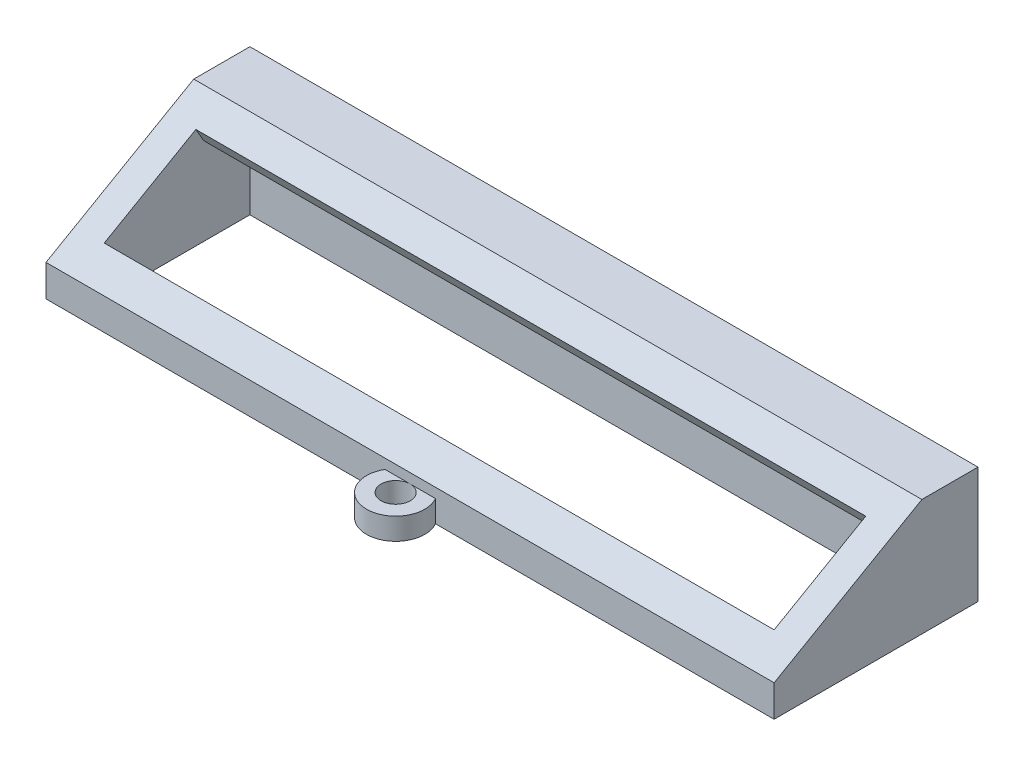
ISO-10303-21;
HEADER;
FILE_DESCRIPTION(('STEP AP214'),'2;1');
FILE_NAME('part.step','',(''),(''),'','','');
FILE_SCHEMA(('AUTOMOTIVE_DESIGN { 1 0 10303 214 1 1 1 1 }'));
ENDSEC;
DATA;
#1=APPLICATION_CONTEXT('core data for automotive mechanical design processes');
#2=APPLICATION_PROTOCOL_DEFINITION('international standard','automotive_design',2000,#1);
#3=PRODUCT_CONTEXT('',#1,'mechanical');
#4=PRODUCT('Part','Part','',(#3));
#5=PRODUCT_RELATED_PRODUCT_CATEGORY('part','',(#4));
#6=PRODUCT_DEFINITION_FORMATION('','',#4);
#7=PRODUCT_DEFINITION_CONTEXT('part definition',#1,'design');
#8=PRODUCT_DEFINITION('design','',#6,#7);
#9=PRODUCT_DEFINITION_SHAPE('','',#8);
#10=(LENGTH_UNIT() NAMED_UNIT(*) SI_UNIT(.MILLI.,.METRE.));
#11=(NAMED_UNIT(*) PLANE_ANGLE_UNIT() SI_UNIT($,.RADIAN.));
#12=(NAMED_UNIT(*) SI_UNIT($,.STERADIAN.) SOLID_ANGLE_UNIT());
#13=UNCERTAINTY_MEASURE_WITH_UNIT(LENGTH_MEASURE(1.E-05),#10,'distance_accuracy_value','');
#14=(GEOMETRIC_REPRESENTATION_CONTEXT(3) GLOBAL_UNCERTAINTY_ASSIGNED_CONTEXT((#13)) GLOBAL_UNIT_ASSIGNED_CONTEXT((#10,
#11,#12)) REPRESENTATION_CONTEXT('',''));
#15=CARTESIAN_POINT('',(0.,0.,0.));
#16=DIRECTION('',(0.,0.,1.));
#17=DIRECTION('',(1.,0.,0.));
#18=AXIS2_PLACEMENT_3D('',#15,#16,#17);
#19=CARTESIAN_POINT('',(250.,80.,-70.));
#20=DIRECTION('',(-1.,0.,0.));
#21=DIRECTION('',(0.,0.,1.));
#22=AXIS2_PLACEMENT_3D('',#19,#20,#21);
#23=PLANE('',#22);
#24=DIRECTION('',(0.,0.,-1.));
#25=VECTOR('',#24,1.);
#26=CARTESIAN_POINT('',(250.,80.,-70.));
#27=LINE('',#26,#25);
#28=CARTESIAN_POINT('',(250.,80.,-31.4570736418901));
#29=VERTEX_POINT('',#28);
#30=CARTESIAN_POINT('',(250.,80.,-70.));
#31=VERTEX_POINT('',#30);
#32=EDGE_CURVE('E215',#29,#31,#27,.T.);
#33=ORIENTED_EDGE('',*,*,#32,.F.);
#34=DIRECTION('',(0.,0.498039271037889,-0.86715447557171));
#35=VECTOR('',#34,1.);
#36=CARTESIAN_POINT('',(250.,21.729405288567,70.));
#37=LINE('',#36,#35);
#38=CARTESIAN_POINT('',(250.,21.729405288567,70.));
#39=VERTEX_POINT('',#38);
#40=EDGE_CURVE('E53',#39,#29,#37,.T.);
#41=ORIENTED_EDGE('',*,*,#40,.F.);
#42=DIRECTION('',(0.,-1.,0.));
#43=VECTOR('',#42,1.);
#44=CARTESIAN_POINT('',(250.,80.,70.));
#45=LINE('',#44,#43);
#46=CARTESIAN_POINT('',(250.,0.,70.));
#47=VERTEX_POINT('',#46);
#48=EDGE_CURVE('E223',#39,#47,#45,.T.);
#49=ORIENTED_EDGE('',*,*,#48,.T.);
#50=DIRECTION('',(0.,0.,-1.));
#51=VECTOR('',#50,1.);
#52=CARTESIAN_POINT('',(250.,0.,-70.));
#53=LINE('',#52,#51);
#54=CARTESIAN_POINT('',(250.,0.,-70.));
#55=VERTEX_POINT('',#54);
#56=EDGE_CURVE('E209',#47,#55,#53,.T.);
#57=ORIENTED_EDGE('',*,*,#56,.T.);
#58=DIRECTION('',(0.,-1.,0.));
#59=VECTOR('',#58,1.);
#60=CARTESIAN_POINT('',(250.,80.,-70.));
#61=LINE('',#60,#59);
#62=EDGE_CURVE('E238',#31,#55,#61,.T.);
#63=ORIENTED_EDGE('',*,*,#62,.F.);
#64=EDGE_LOOP('',(#33,#41,#49,#57,#63));
#65=FACE_BOUND('',#64,.T.);
#66=ADVANCED_FACE('F39',(#65),#23,.F.);
#67=CARTESIAN_POINT('',(-250.,80.,-70.));
#68=DIRECTION('',(0.,0.,1.));
#69=DIRECTION('',(1.,0.,0.));
#70=AXIS2_PLACEMENT_3D('',#67,#68,#69);
#71=PLANE('',#70);
#72=DIRECTION('',(-1.,0.,0.));
#73=VECTOR('',#72,1.);
#74=CARTESIAN_POINT('',(-250.,0.,-70.));
#75=LINE('',#74,#73);
#76=CARTESIAN_POINT('',(-250.,0.,-70.));
#77=VERTEX_POINT('',#76);
#78=EDGE_CURVE('E226',#55,#77,#75,.T.);
#79=ORIENTED_EDGE('',*,*,#78,.T.);
#80=DIRECTION('',(0.,-1.,0.));
#81=VECTOR('',#80,1.);
#82=CARTESIAN_POINT('',(-250.,80.,-70.));
#83=LINE('',#82,#81);
#84=CARTESIAN_POINT('',(-250.,80.,-70.));
#85=VERTEX_POINT('',#84);
#86=EDGE_CURVE('E236',#85,#77,#83,.T.);
#87=ORIENTED_EDGE('',*,*,#86,.F.);
#88=DIRECTION('',(-1.,0.,0.));
#89=VECTOR('',#88,1.);
#90=CARTESIAN_POINT('',(-250.,80.,-70.));
#91=LINE('',#90,#89);
#92=EDGE_CURVE('E217',#31,#85,#91,.T.);
#93=ORIENTED_EDGE('',*,*,#92,.F.);
#94=ORIENTED_EDGE('',*,*,#62,.T.);
#95=EDGE_LOOP('',(#79,#87,#93,#94));
#96=FACE_BOUND('',#95,.T.);
#97=ADVANCED_FACE('F270',(#96),#71,.F.);
#98=CARTESIAN_POINT('',(-250.,80.,-70.));
#99=DIRECTION('',(1.,0.,0.));
#100=DIRECTION('',(0.,0.,-1.));
#101=AXIS2_PLACEMENT_3D('',#98,#99,#100);
#102=PLANE('',#101);
#103=DIRECTION('',(0.,-1.,0.));
#104=VECTOR('',#103,1.);
#105=CARTESIAN_POINT('',(-250.,80.,70.));
#106=LINE('',#105,#104);
#107=CARTESIAN_POINT('',(-250.,21.729405288567,70.));
#108=VERTEX_POINT('',#107);
#109=CARTESIAN_POINT('',(-250.,0.,70.));
#110=VERTEX_POINT('',#109);
#111=EDGE_CURVE('E234',#108,#110,#106,.T.);
#112=ORIENTED_EDGE('',*,*,#111,.F.);
#113=DIRECTION('',(0.,0.498039271037889,-0.86715447557171));
#114=VECTOR('',#113,1.);
#115=CARTESIAN_POINT('',(-250.,21.729405288567,70.));
#116=LINE('',#115,#114);
#117=CARTESIAN_POINT('',(-250.,80.,-31.4570736418901));
#118=VERTEX_POINT('',#117);
#119=EDGE_CURVE('E164',#108,#118,#116,.T.);
#120=ORIENTED_EDGE('',*,*,#119,.T.);
#121=DIRECTION('',(0.,0.,1.));
#122=VECTOR('',#121,1.);
#123=CARTESIAN_POINT('',(-250.,80.,-70.));
#124=LINE('',#123,#122);
#125=EDGE_CURVE('E220',#85,#118,#124,.T.);
#126=ORIENTED_EDGE('',*,*,#125,.F.);
#127=ORIENTED_EDGE('',*,*,#86,.T.);
#128=DIRECTION('',(0.,0.,1.));
#129=VECTOR('',#128,1.);
#130=CARTESIAN_POINT('',(-250.,0.,-70.));
#131=LINE('',#130,#129);
#132=EDGE_CURVE('E228',#77,#110,#131,.T.);
#133=ORIENTED_EDGE('',*,*,#132,.T.);
#134=EDGE_LOOP('',(#112,#120,#126,#127,#133));
#135=FACE_BOUND('',#134,.T.);
#136=ADVANCED_FACE('F267',(#135),#102,.F.);
#137=CARTESIAN_POINT('',(-250.,80.,70.));
#138=DIRECTION('',(0.,0.,-1.));
#139=DIRECTION('',(-1.,0.,0.));
#140=AXIS2_PLACEMENT_3D('',#137,#138,#139);
#141=PLANE('',#140);
#142=ORIENTED_EDGE('',*,*,#48,.F.);
#143=DIRECTION('',(1.,0.,0.));
#144=VECTOR('',#143,1.);
#145=CARTESIAN_POINT('',(-250.,21.729405288567,70.));
#146=LINE('',#145,#144);
#147=EDGE_CURVE('E167',#108,#39,#146,.T.);
#148=ORIENTED_EDGE('',*,*,#147,.F.);
#149=ORIENTED_EDGE('',*,*,#111,.T.);
#150=DIRECTION('',(1.,0.,0.));
#151=VECTOR('',#150,1.);
#152=CARTESIAN_POINT('',(-250.,0.,70.));
#153=LINE('',#152,#151);
#154=CARTESIAN_POINT('',(-17.2065014470406,0.,70.));
#155=VERTEX_POINT('',#154);
#156=EDGE_CURVE('E218',#110,#155,#153,.T.);
#157=ORIENTED_EDGE('',*,*,#156,.T.);
#158=DIRECTION('',(0.,-1.,0.));
#159=VECTOR('',#158,1.);
#160=CARTESIAN_POINT('',(-17.2065014470406,15.,70.));
#161=LINE('',#160,#159);
#162=CARTESIAN_POINT('',(-17.2065014470406,15.,70.));
#163=VERTEX_POINT('',#162);
#164=EDGE_CURVE('E183',#155,#163,#161,.F.);
#165=ORIENTED_EDGE('',*,*,#164,.T.);
#166=DIRECTION('',(-1.,0.,0.));
#167=VECTOR('',#166,1.);
#168=CARTESIAN_POINT('',(-250.,15.,70.));
#169=LINE('',#168,#167);
#170=CARTESIAN_POINT('',(0.11400662864814,15.,70.));
#171=VERTEX_POINT('',#170);
#172=EDGE_CURVE('E42',#171,#163,#169,.T.);
#173=ORIENTED_EDGE('',*,*,#172,.F.);
#174=CARTESIAN_POINT('',(17.4345147043369,15.,70.));
#175=VERTEX_POINT('',#174);
#176=EDGE_CURVE('E12',#175,#171,#169,.T.);
#177=ORIENTED_EDGE('',*,*,#176,.F.);
#178=DIRECTION('',(0.,-1.,0.));
#179=VECTOR('',#178,1.);
#180=CARTESIAN_POINT('',(17.4345147043369,15.,70.));
#181=LINE('',#180,#179);
#182=CARTESIAN_POINT('',(17.4345147043369,0.,70.));
#183=VERTEX_POINT('',#182);
#184=EDGE_CURVE('E187',#175,#183,#181,.T.);
#185=ORIENTED_EDGE('',*,*,#184,.T.);
#186=EDGE_CURVE('E231',#183,#47,#153,.T.);
#187=ORIENTED_EDGE('',*,*,#186,.T.);
#188=EDGE_LOOP('',(#142,#148,#149,#157,#165,#173,#177,#185,#187));
#189=FACE_BOUND('',#188,.T.);
#190=ADVANCED_FACE('F255',(#189),#141,.F.);
#191=CARTESIAN_POINT('',(0.,80.,0.));
#192=DIRECTION('',(0.,1.,0.));
#193=DIRECTION('',(0.,0.,1.));
#194=AXIS2_PLACEMENT_3D('',#191,#192,#193);
#195=PLANE('',#194);
#196=DIRECTION('',(1.,0.,0.));
#197=VECTOR('',#196,1.);
#198=CARTESIAN_POINT('',(-250.,80.,-31.4570736418901));
#199=LINE('',#198,#197);
#200=EDGE_CURVE('E146',#118,#29,#199,.T.);
#201=ORIENTED_EDGE('',*,*,#200,.T.);
#202=ORIENTED_EDGE('',*,*,#32,.T.);
#203=ORIENTED_EDGE('',*,*,#92,.T.);
#204=ORIENTED_EDGE('',*,*,#125,.T.);
#205=EDGE_LOOP('',(#201,#202,#203,#204));
#206=FACE_BOUND('',#205,.T.);
#207=ADVANCED_FACE('F272',(#206),#195,.T.);
#208=CARTESIAN_POINT('',(0.,0.,0.));
#209=DIRECTION('',(0.,1.,0.));
#210=DIRECTION('',(0.,0.,1.));
#211=AXIS2_PLACEMENT_3D('',#208,#209,#210);
#212=PLANE('',#211);
#213=ORIENTED_EDGE('',*,*,#186,.F.);
#214=CARTESIAN_POINT('',(0.11400662864814,0.,80.));
#215=DIRECTION('',(0.,-1.,0.));
#216=DIRECTION('',(1.,0.,0.));
#217=AXIS2_PLACEMENT_3D('',#214,#215,#216);
#218=CIRCLE('',#217,20.);
#219=EDGE_CURVE('E177',#183,#155,#218,.T.);
#220=ORIENTED_EDGE('',*,*,#219,.T.);
#221=ORIENTED_EDGE('',*,*,#156,.F.);
#222=ORIENTED_EDGE('',*,*,#132,.F.);
#223=ORIENTED_EDGE('',*,*,#78,.F.);
#224=ORIENTED_EDGE('',*,*,#56,.F.);
#225=EDGE_LOOP('',(#213,#220,#221,#222,#223,#224));
#226=FACE_BOUND('',#225,.T.);
#227=DIRECTION('',(1.,0.,0.));
#228=VECTOR('',#227,1.);
#229=CARTESIAN_POINT('',(230.,0.,-50.));
#230=LINE('',#229,#228);
#231=CARTESIAN_POINT('',(-230.,0.,-50.));
#232=VERTEX_POINT('',#231);
#233=CARTESIAN_POINT('',(230.,0.,-50.));
#234=VERTEX_POINT('',#233);
#235=EDGE_CURVE('E200',#232,#234,#230,.T.);
#236=ORIENTED_EDGE('',*,*,#235,.F.);
#237=DIRECTION('',(0.,0.,-1.));
#238=VECTOR('',#237,1.);
#239=CARTESIAN_POINT('',(-230.,0.,50.));
#240=LINE('',#239,#238);
#241=CARTESIAN_POINT('',(-230.,0.,50.));
#242=VERTEX_POINT('',#241);
#243=EDGE_CURVE('E189',#242,#232,#240,.T.);
#244=ORIENTED_EDGE('',*,*,#243,.F.);
#245=DIRECTION('',(-1.,0.,0.));
#246=VECTOR('',#245,1.);
#247=CARTESIAN_POINT('',(230.,0.,50.));
#248=LINE('',#247,#246);
#249=CARTESIAN_POINT('',(230.,0.,50.));
#250=VERTEX_POINT('',#249);
#251=EDGE_CURVE('E193',#250,#242,#248,.T.);
#252=ORIENTED_EDGE('',*,*,#251,.F.);
#253=DIRECTION('',(0.,0.,1.));
#254=VECTOR('',#253,1.);
#255=CARTESIAN_POINT('',(230.,0.,50.));
#256=LINE('',#255,#254);
#257=EDGE_CURVE('E203',#234,#250,#256,.T.);
#258=ORIENTED_EDGE('',*,*,#257,.F.);
#259=EDGE_LOOP('',(#236,#244,#252,#258));
#260=FACE_BOUND('',#259,.T.);
#261=CARTESIAN_POINT('',(0.11400662864814,0.,80.));
#262=DIRECTION('',(0.,-1.,0.));
#263=DIRECTION('',(0.,0.,-1.));
#264=AXIS2_PLACEMENT_3D('',#261,#262,#263);
#265=CIRCLE('',#264,10.);
#266=CARTESIAN_POINT('',(0.11400662864814,0.,70.));
#267=VERTEX_POINT('',#266);
#268=EDGE_CURVE('E173',#267,#267,#265,.T.);
#269=ORIENTED_EDGE('',*,*,#268,.F.);
#270=EDGE_LOOP('',(#269));
#271=FACE_BOUND('',#270,.T.);
#272=ADVANCED_FACE('F258',(#226,#260,#271),#212,.F.);
#273=CARTESIAN_POINT('',(-230.,60.,50.));
#274=DIRECTION('',(-1.,0.,0.));
#275=DIRECTION('',(0.,0.,1.));
#276=AXIS2_PLACEMENT_3D('',#273,#274,#275);
#277=PLANE('',#276);
#278=DIRECTION('',(0.,0.86715447557171,0.498039271037889));
#279=VECTOR('',#278,1.);
#280=CARTESIAN_POINT('',(-230.,56.3385513438544,-20.3773628207185));
#281=LINE('',#280,#279);
#282=CARTESIAN_POINT('',(-230.,60.,-18.2744558173876));
#283=VERTEX_POINT('',#282);
#284=CARTESIAN_POINT('',(-230.,69.34586847743,-12.9067737551501));
#285=VERTEX_POINT('',#284);
#286=EDGE_CURVE('E154',#283,#285,#281,.T.);
#287=ORIENTED_EDGE('',*,*,#286,.T.);
#288=DIRECTION('',(0.,-0.498039271037889,0.86715447557171));
#289=VECTOR('',#288,1.);
#290=CARTESIAN_POINT('',(-230.,39.8597024904933,38.432673332502));
#291=LINE('',#290,#289);
#292=CARTESIAN_POINT('',(-230.,33.2161538453229,50.));
#293=VERTEX_POINT('',#292);
#294=EDGE_CURVE('E158',#285,#293,#291,.T.);
#295=ORIENTED_EDGE('',*,*,#294,.T.);
#296=DIRECTION('',(0.,-1.,0.));
#297=VECTOR('',#296,1.);
#298=CARTESIAN_POINT('',(-230.,60.,50.));
#299=LINE('',#298,#297);
#300=EDGE_CURVE('E207',#293,#242,#299,.T.);
#301=ORIENTED_EDGE('',*,*,#300,.T.);
#302=ORIENTED_EDGE('',*,*,#243,.T.);
#303=DIRECTION('',(0.,-1.,0.));
#304=VECTOR('',#303,1.);
#305=CARTESIAN_POINT('',(-230.,60.,-50.));
#306=LINE('',#305,#304);
#307=CARTESIAN_POINT('',(-230.,60.,-50.));
#308=VERTEX_POINT('',#307);
#309=EDGE_CURVE('E198',#308,#232,#306,.T.);
#310=ORIENTED_EDGE('',*,*,#309,.F.);
#311=DIRECTION('',(0.,0.,-1.));
#312=VECTOR('',#311,1.);
#313=CARTESIAN_POINT('',(-230.,60.,50.));
#314=LINE('',#313,#312);
#315=EDGE_CURVE('E190',#283,#308,#314,.T.);
#316=ORIENTED_EDGE('',*,*,#315,.F.);
#317=EDGE_LOOP('',(#287,#295,#301,#302,#310,#316));
#318=FACE_BOUND('',#317,.T.);
#319=ADVANCED_FACE('F299',(#318),#277,.F.);
#320=CARTESIAN_POINT('',(230.,60.,50.));
#321=DIRECTION('',(0.,0.,1.));
#322=DIRECTION('',(1.,0.,0.));
#323=AXIS2_PLACEMENT_3D('',#320,#321,#322);
#324=PLANE('',#323);
#325=ORIENTED_EDGE('',*,*,#300,.F.);
#326=DIRECTION('',(1.,0.,0.));
#327=VECTOR('',#326,1.);
#328=CARTESIAN_POINT('',(230.,33.2161538453229,50.));
#329=LINE('',#328,#327);
#330=CARTESIAN_POINT('',(230.,33.2161538453229,50.));
#331=VERTEX_POINT('',#330);
#332=EDGE_CURVE('E145',#293,#331,#329,.T.);
#333=ORIENTED_EDGE('',*,*,#332,.T.);
#334=DIRECTION('',(0.,-1.,0.));
#335=VECTOR('',#334,1.);
#336=CARTESIAN_POINT('',(230.,60.,50.));
#337=LINE('',#336,#335);
#338=EDGE_CURVE('E141',#331,#250,#337,.T.);
#339=ORIENTED_EDGE('',*,*,#338,.T.);
#340=ORIENTED_EDGE('',*,*,#251,.T.);
#341=EDGE_LOOP('',(#325,#333,#339,#340));
#342=FACE_BOUND('',#341,.T.);
#343=ADVANCED_FACE('F304',(#342),#324,.F.);
#344=CARTESIAN_POINT('',(230.,60.,50.));
#345=DIRECTION('',(1.,0.,0.));
#346=DIRECTION('',(0.,0.,-1.));
#347=AXIS2_PLACEMENT_3D('',#344,#345,#346);
#348=PLANE('',#347);
#349=DIRECTION('',(0.,0.86715447557171,0.498039271037889));
#350=VECTOR('',#349,1.);
#351=CARTESIAN_POINT('',(230.,56.3385513438544,-20.3773628207185));
#352=LINE('',#351,#350);
#353=CARTESIAN_POINT('',(230.,60.,-18.2744558173876));
#354=VERTEX_POINT('',#353);
#355=CARTESIAN_POINT('',(230.,69.34586847743,-12.9067737551501));
#356=VERTEX_POINT('',#355);
#357=EDGE_CURVE('E138',#354,#356,#352,.T.);
#358=ORIENTED_EDGE('',*,*,#357,.F.);
#359=DIRECTION('',(0.,0.,1.));
#360=VECTOR('',#359,1.);
#361=CARTESIAN_POINT('',(230.,60.,50.));
#362=LINE('',#361,#360);
#363=CARTESIAN_POINT('',(230.,60.,-50.));
#364=VERTEX_POINT('',#363);
#365=EDGE_CURVE('E196',#364,#354,#362,.T.);
#366=ORIENTED_EDGE('',*,*,#365,.F.);
#367=DIRECTION('',(0.,-1.,0.));
#368=VECTOR('',#367,1.);
#369=CARTESIAN_POINT('',(230.,60.,-50.));
#370=LINE('',#369,#368);
#371=EDGE_CURVE('E211',#364,#234,#370,.T.);
#372=ORIENTED_EDGE('',*,*,#371,.T.);
#373=ORIENTED_EDGE('',*,*,#257,.T.);
#374=ORIENTED_EDGE('',*,*,#338,.F.);
#375=DIRECTION('',(0.,0.498039271037889,-0.86715447557171));
#376=VECTOR('',#375,1.);
#377=CARTESIAN_POINT('',(230.,39.8597024904933,38.432673332502));
#378=LINE('',#377,#376);
#379=EDGE_CURVE('E134',#331,#356,#378,.T.);
#380=ORIENTED_EDGE('',*,*,#379,.T.);
#381=EDGE_LOOP('',(#358,#366,#372,#373,#374,#380));
#382=FACE_BOUND('',#381,.T.);
#383=ADVANCED_FACE('F136',(#382),#348,.F.);
#384=CARTESIAN_POINT('',(230.,60.,-50.));
#385=DIRECTION('',(0.,0.,-1.));
#386=DIRECTION('',(-1.,0.,0.));
#387=AXIS2_PLACEMENT_3D('',#384,#385,#386);
#388=PLANE('',#387);
#389=ORIENTED_EDGE('',*,*,#235,.T.);
#390=ORIENTED_EDGE('',*,*,#371,.F.);
#391=DIRECTION('',(1.,0.,0.));
#392=VECTOR('',#391,1.);
#393=CARTESIAN_POINT('',(230.,60.,-50.));
#394=LINE('',#393,#392);
#395=EDGE_CURVE('E192',#308,#364,#394,.T.);
#396=ORIENTED_EDGE('',*,*,#395,.F.);
#397=ORIENTED_EDGE('',*,*,#309,.T.);
#398=EDGE_LOOP('',(#389,#390,#396,#397));
#399=FACE_BOUND('',#398,.T.);
#400=ADVANCED_FACE('F306',(#399),#388,.F.);
#401=CARTESIAN_POINT('',(0.,60.,0.));
#402=DIRECTION('',(0.,1.,0.));
#403=DIRECTION('',(0.,0.,1.));
#404=AXIS2_PLACEMENT_3D('',#401,#402,#403);
#405=PLANE('',#404);
#406=ORIENTED_EDGE('',*,*,#365,.T.);
#407=DIRECTION('',(-1.,0.,0.));
#408=VECTOR('',#407,1.);
#409=CARTESIAN_POINT('',(0.,60.,-18.2744558173876));
#410=LINE('',#409,#408);
#411=EDGE_CURVE('E153',#354,#283,#410,.T.);
#412=ORIENTED_EDGE('',*,*,#411,.T.);
#413=ORIENTED_EDGE('',*,*,#315,.T.);
#414=ORIENTED_EDGE('',*,*,#395,.T.);
#415=EDGE_LOOP('',(#406,#412,#413,#414));
#416=FACE_BOUND('',#415,.T.);
#417=ADVANCED_FACE('F309',(#416),#405,.F.);
#418=CARTESIAN_POINT('',(0.11400662864814,15.,80.));
#419=DIRECTION('',(0.,-1.,0.));
#420=DIRECTION('',(0.,0.,-1.));
#421=AXIS2_PLACEMENT_3D('',#418,#419,#420);
#422=PLANE('',#421);
#423=CARTESIAN_POINT('',(0.11400662864814,15.,80.));
#424=DIRECTION('',(0.,-1.,0.));
#425=DIRECTION('',(1.,0.,0.));
#426=AXIS2_PLACEMENT_3D('',#423,#424,#425);
#427=CIRCLE('',#426,20.);
#428=EDGE_CURVE('E180',#175,#163,#427,.T.);
#429=ORIENTED_EDGE('',*,*,#428,.F.);
#430=ORIENTED_EDGE('',*,*,#176,.T.);
#431=CARTESIAN_POINT('',(0.11400662864814,15.,80.));
#432=DIRECTION('',(0.,-1.,0.));
#433=DIRECTION('',(0.,0.,-1.));
#434=AXIS2_PLACEMENT_3D('',#431,#432,#433);
#435=CIRCLE('',#434,10.);
#436=EDGE_CURVE('E174',#171,#171,#435,.T.);
#437=ORIENTED_EDGE('',*,*,#436,.T.);
#438=ORIENTED_EDGE('',*,*,#172,.T.);
#439=EDGE_LOOP('',(#429,#430,#437,#438));
#440=FACE_BOUND('',#439,.T.);
#441=ADVANCED_FACE('F246',(#440),#422,.F.);
#442=CARTESIAN_POINT('',(0.11400662864814,15.,80.));
#443=DIRECTION('',(0.,-1.,0.));
#444=DIRECTION('',(0.,0.,-1.));
#445=AXIS2_PLACEMENT_3D('',#442,#443,#444);
#446=CYLINDRICAL_SURFACE('',#445,20.);
#447=ORIENTED_EDGE('',*,*,#184,.F.);
#448=ORIENTED_EDGE('',*,*,#428,.T.);
#449=ORIENTED_EDGE('',*,*,#164,.F.);
#450=ORIENTED_EDGE('',*,*,#219,.F.);
#451=EDGE_LOOP('',(#447,#448,#449,#450));
#452=FACE_BOUND('',#451,.T.);
#453=ADVANCED_FACE('F250',(#452),#446,.T.);
#454=CARTESIAN_POINT('',(0.11400662864814,15.,80.));
#455=DIRECTION('',(0.,-1.,0.));
#456=DIRECTION('',(0.,0.,-1.));
#457=AXIS2_PLACEMENT_3D('',#454,#455,#456);
#458=CYLINDRICAL_SURFACE('',#457,10.);
#459=ORIENTED_EDGE('',*,*,#268,.T.);
#460=EDGE_LOOP('',(#459));
#461=FACE_BOUND('',#460,.T.);
#462=ORIENTED_EDGE('',*,*,#436,.F.);
#463=EDGE_LOOP('',(#462));
#464=FACE_BOUND('',#463,.T.);
#465=ADVANCED_FACE('F274',(#461,#464),#458,.F.);
#466=CARTESIAN_POINT('',(-250.,21.729405288567,70.));
#467=DIRECTION('',(0.,-0.86715447557171,-0.498039271037889));
#468=DIRECTION('',(0.,0.498039271037889,-0.86715447557171));
#469=AXIS2_PLACEMENT_3D('',#466,#467,#468);
#470=PLANE('',#469);
#471=ORIENTED_EDGE('',*,*,#40,.T.);
#472=ORIENTED_EDGE('',*,*,#200,.F.);
#473=ORIENTED_EDGE('',*,*,#119,.F.);
#474=ORIENTED_EDGE('',*,*,#147,.T.);
#475=EDGE_LOOP('',(#471,#472,#473,#474));
#476=FACE_BOUND('',#475,.T.);
#477=ORIENTED_EDGE('',*,*,#294,.F.);
#478=DIRECTION('',(-1.,0.,0.));
#479=VECTOR('',#478,1.);
#480=CARTESIAN_POINT('',(-230.,69.34586847743,-12.9067737551501));
#481=LINE('',#480,#479);
#482=EDGE_CURVE('E151',#356,#285,#481,.T.);
#483=ORIENTED_EDGE('',*,*,#482,.F.);
#484=ORIENTED_EDGE('',*,*,#379,.F.);
#485=ORIENTED_EDGE('',*,*,#332,.F.);
#486=EDGE_LOOP('',(#477,#483,#484,#485));
#487=FACE_BOUND('',#486,.T.);
#488=ADVANCED_FACE('F156',(#476,#487),#470,.F.);
#489=CARTESIAN_POINT('',(-230.,56.3385513438544,-20.3773628207185));
#490=DIRECTION('',(0.,0.498039271037889,-0.86715447557171));
#491=DIRECTION('',(0.,0.86715447557171,0.498039271037889));
#492=AXIS2_PLACEMENT_3D('',#489,#490,#491);
#493=PLANE('',#492);
#494=ORIENTED_EDGE('',*,*,#357,.T.);
#495=ORIENTED_EDGE('',*,*,#482,.T.);
#496=ORIENTED_EDGE('',*,*,#286,.F.);
#497=ORIENTED_EDGE('',*,*,#411,.F.);
#498=EDGE_LOOP('',(#494,#495,#496,#497));
#499=FACE_BOUND('',#498,.T.);
#500=ADVANCED_FACE('F150',(#499),#493,.F.);
#501=CLOSED_SHELL('',(#66,#97,#136,#190,#207,#272,#319,#343,#383,#400,#417,#441,#453,#465,#488,#500));
#502=MANIFOLD_SOLID_BREP('B2',#501);
#503=ADVANCED_BREP_SHAPE_REPRESENTATION('',(#18,#502),#14);
#504=SHAPE_DEFINITION_REPRESENTATION(#9,#503);
ENDSEC;
END-ISO-10303-21;
